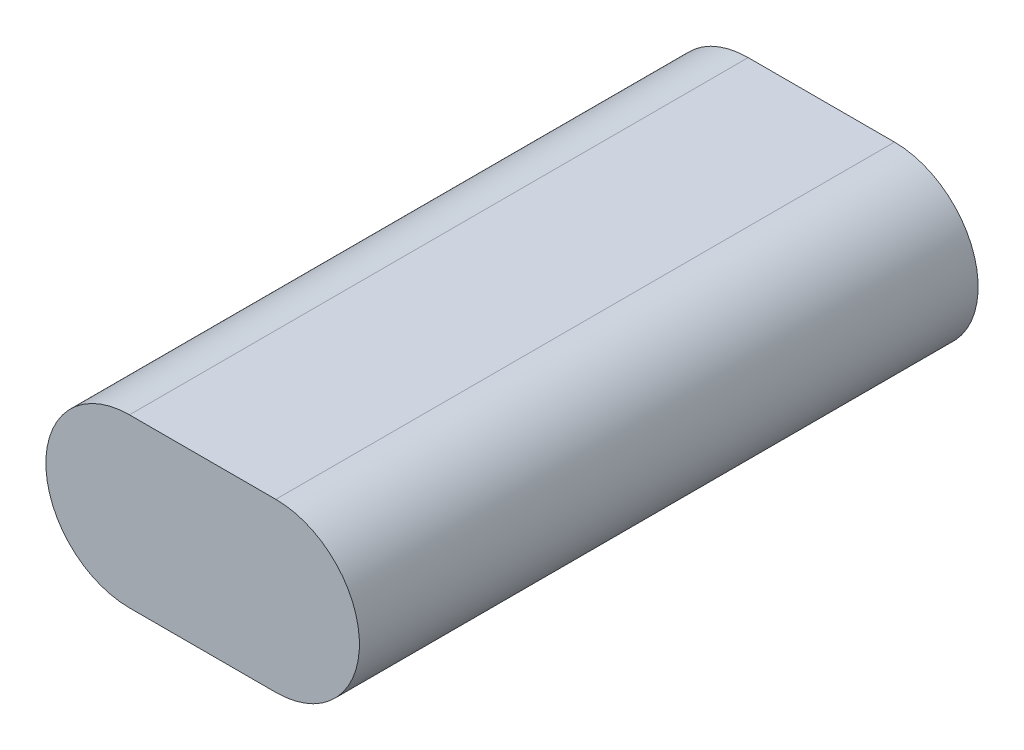
ISO-10303-21;
HEADER;
FILE_DESCRIPTION(('STEP AP214'),'2;1');
FILE_NAME('part.step','',(''),(''),'','','');
FILE_SCHEMA(('AUTOMOTIVE_DESIGN { 1 0 10303 214 1 1 1 1 }'));
ENDSEC;
DATA;
#1=APPLICATION_CONTEXT('core data for automotive mechanical design processes');
#2=APPLICATION_PROTOCOL_DEFINITION('international standard','automotive_design',2000,#1);
#3=PRODUCT_CONTEXT('',#1,'mechanical');
#4=PRODUCT('Part','Part','',(#3));
#5=PRODUCT_RELATED_PRODUCT_CATEGORY('part','',(#4));
#6=PRODUCT_DEFINITION_FORMATION('','',#4);
#7=PRODUCT_DEFINITION_CONTEXT('part definition',#1,'design');
#8=PRODUCT_DEFINITION('design','',#6,#7);
#9=PRODUCT_DEFINITION_SHAPE('','',#8);
#10=(LENGTH_UNIT() NAMED_UNIT(*) SI_UNIT(.MILLI.,.METRE.));
#11=(NAMED_UNIT(*) PLANE_ANGLE_UNIT() SI_UNIT($,.RADIAN.));
#12=(NAMED_UNIT(*) SI_UNIT($,.STERADIAN.) SOLID_ANGLE_UNIT());
#13=UNCERTAINTY_MEASURE_WITH_UNIT(LENGTH_MEASURE(1.E-05),#10,'distance_accuracy_value','');
#14=(GEOMETRIC_REPRESENTATION_CONTEXT(3) GLOBAL_UNCERTAINTY_ASSIGNED_CONTEXT((#13)) GLOBAL_UNIT_ASSIGNED_CONTEXT((#10,
#11,#12)) REPRESENTATION_CONTEXT('',''));
#15=CARTESIAN_POINT('',(0.,0.,0.));
#16=DIRECTION('',(0.,0.,1.));
#17=DIRECTION('',(1.,0.,0.));
#18=AXIS2_PLACEMENT_3D('',#15,#16,#17);
#19=CARTESIAN_POINT('',(8.75,10.,37.));
#20=DIRECTION('',(0.,0.,-1.));
#21=DIRECTION('',(-1.,0.,0.));
#22=AXIS2_PLACEMENT_3D('',#19,#20,#21);
#23=CYLINDRICAL_SURFACE('',#22,10.);
#24=DIRECTION('',(0.,0.,1.));
#25=VECTOR('',#24,1.);
#26=CARTESIAN_POINT('',(8.75,20.,37.));
#27=LINE('',#26,#25);
#28=CARTESIAN_POINT('',(8.75,20.,37.));
#29=VERTEX_POINT('',#28);
#30=CARTESIAN_POINT('',(8.75,20.,-37.));
#31=VERTEX_POINT('',#30);
#32=EDGE_CURVE('E98',#29,#31,#27,.F.);
#33=ORIENTED_EDGE('',*,*,#32,.F.);
#34=CARTESIAN_POINT('',(8.75,10.,37.));
#35=DIRECTION('',(0.,0.,-1.));
#36=DIRECTION('',(-1.,0.,0.));
#37=AXIS2_PLACEMENT_3D('',#34,#35,#36);
#38=CIRCLE('',#37,10.);
#39=CARTESIAN_POINT('',(8.75,0.,37.));
#40=VERTEX_POINT('',#39);
#41=EDGE_CURVE('E56',#40,#29,#38,.F.);
#42=ORIENTED_EDGE('',*,*,#41,.F.);
#43=DIRECTION('',(0.,0.,-1.));
#44=VECTOR('',#43,1.);
#45=CARTESIAN_POINT('',(8.75,0.,0.));
#46=LINE('',#45,#44);
#47=CARTESIAN_POINT('',(8.75,0.,-37.));
#48=VERTEX_POINT('',#47);
#49=EDGE_CURVE('E128',#48,#40,#46,.F.);
#50=ORIENTED_EDGE('',*,*,#49,.F.);
#51=CARTESIAN_POINT('',(8.75,10.,-37.));
#52=DIRECTION('',(0.,0.,1.));
#53=DIRECTION('',(1.,0.,0.));
#54=AXIS2_PLACEMENT_3D('',#51,#52,#53);
#55=CIRCLE('',#54,10.);
#56=EDGE_CURVE('E11',#31,#48,#55,.F.);
#57=ORIENTED_EDGE('',*,*,#56,.F.);
#58=EDGE_LOOP('',(#33,#42,#50,#57));
#59=FACE_BOUND('',#58,.T.);
#60=ADVANCED_FACE('F47',(#59),#23,.T.);
#61=CARTESIAN_POINT('',(-8.74999999999999,10.,-37.));
#62=DIRECTION('',(0.,0.,1.));
#63=DIRECTION('',(1.,0.,0.));
#64=AXIS2_PLACEMENT_3D('',#61,#62,#63);
#65=CYLINDRICAL_SURFACE('',#64,10.);
#66=DIRECTION('',(0.,0.,-1.));
#67=VECTOR('',#66,1.);
#68=CARTESIAN_POINT('',(-8.74999999999999,20.,-37.));
#69=LINE('',#68,#67);
#70=CARTESIAN_POINT('',(-8.74999999999999,20.,-37.));
#71=VERTEX_POINT('',#70);
#72=CARTESIAN_POINT('',(-8.75,20.,37.));
#73=VERTEX_POINT('',#72);
#74=EDGE_CURVE('E90',#71,#73,#69,.F.);
#75=ORIENTED_EDGE('',*,*,#74,.F.);
#76=CARTESIAN_POINT('',(-8.74999999999999,10.,-37.));
#77=DIRECTION('',(0.,0.,1.));
#78=DIRECTION('',(1.,0.,0.));
#79=AXIS2_PLACEMENT_3D('',#76,#77,#78);
#80=CIRCLE('',#79,10.);
#81=CARTESIAN_POINT('',(-8.74999999999999,0.,-37.));
#82=VERTEX_POINT('',#81);
#83=EDGE_CURVE('E99',#82,#71,#80,.F.);
#84=ORIENTED_EDGE('',*,*,#83,.F.);
#85=DIRECTION('',(0.,0.,1.));
#86=VECTOR('',#85,1.);
#87=CARTESIAN_POINT('',(-8.74999999999999,0.,0.));
#88=LINE('',#87,#86);
#89=CARTESIAN_POINT('',(-8.75,0.,37.));
#90=VERTEX_POINT('',#89);
#91=EDGE_CURVE('E92',#90,#82,#88,.F.);
#92=ORIENTED_EDGE('',*,*,#91,.F.);
#93=CARTESIAN_POINT('',(-8.74999999999999,10.,37.));
#94=DIRECTION('',(0.,0.,-1.));
#95=DIRECTION('',(-1.,0.,0.));
#96=AXIS2_PLACEMENT_3D('',#93,#94,#95);
#97=CIRCLE('',#96,10.);
#98=EDGE_CURVE('E86',#73,#90,#97,.F.);
#99=ORIENTED_EDGE('',*,*,#98,.F.);
#100=EDGE_LOOP('',(#75,#84,#92,#99));
#101=FACE_BOUND('',#100,.T.);
#102=ADVANCED_FACE('F88',(#101),#65,.T.);
#103=CARTESIAN_POINT('',(-18.75,20.,37.));
#104=DIRECTION('',(0.,0.,-1.));
#105=DIRECTION('',(-1.,0.,0.));
#106=AXIS2_PLACEMENT_3D('',#103,#104,#105);
#107=PLANE('',#106);
#108=DIRECTION('',(1.,0.,0.));
#109=VECTOR('',#108,1.);
#110=CARTESIAN_POINT('',(-18.75,0.,37.));
#111=LINE('',#110,#109);
#112=EDGE_CURVE('E117',#90,#40,#111,.T.);
#113=ORIENTED_EDGE('',*,*,#112,.T.);
#114=ORIENTED_EDGE('',*,*,#41,.T.);
#115=DIRECTION('',(1.,0.,0.));
#116=VECTOR('',#115,1.);
#117=CARTESIAN_POINT('',(-18.75,20.,37.));
#118=LINE('',#117,#116);
#119=EDGE_CURVE('E105',#73,#29,#118,.T.);
#120=ORIENTED_EDGE('',*,*,#119,.F.);
#121=ORIENTED_EDGE('',*,*,#98,.T.);
#122=EDGE_LOOP('',(#113,#114,#120,#121));
#123=FACE_BOUND('',#122,.T.);
#124=ADVANCED_FACE('F110',(#123),#107,.F.);
#125=CARTESIAN_POINT('',(-18.75,20.,-37.));
#126=DIRECTION('',(0.,0.,1.));
#127=DIRECTION('',(1.,0.,0.));
#128=AXIS2_PLACEMENT_3D('',#125,#126,#127);
#129=PLANE('',#128);
#130=DIRECTION('',(-1.,0.,0.));
#131=VECTOR('',#130,1.);
#132=CARTESIAN_POINT('',(-18.75,20.,-37.));
#133=LINE('',#132,#131);
#134=EDGE_CURVE('E106',#31,#71,#133,.T.);
#135=ORIENTED_EDGE('',*,*,#134,.F.);
#136=ORIENTED_EDGE('',*,*,#56,.T.);
#137=DIRECTION('',(-1.,0.,0.));
#138=VECTOR('',#137,1.);
#139=CARTESIAN_POINT('',(-18.75,0.,-37.));
#140=LINE('',#139,#138);
#141=EDGE_CURVE('E112',#48,#82,#140,.T.);
#142=ORIENTED_EDGE('',*,*,#141,.T.);
#143=ORIENTED_EDGE('',*,*,#83,.T.);
#144=EDGE_LOOP('',(#135,#136,#142,#143));
#145=FACE_BOUND('',#144,.T.);
#146=ADVANCED_FACE('F134',(#145),#129,.F.);
#147=CARTESIAN_POINT('',(0.,20.,0.));
#148=DIRECTION('',(0.,1.,0.));
#149=DIRECTION('',(0.,0.,1.));
#150=AXIS2_PLACEMENT_3D('',#147,#148,#149);
#151=PLANE('',#150);
#152=ORIENTED_EDGE('',*,*,#119,.T.);
#153=ORIENTED_EDGE('',*,*,#32,.T.);
#154=ORIENTED_EDGE('',*,*,#134,.T.);
#155=ORIENTED_EDGE('',*,*,#74,.T.);
#156=EDGE_LOOP('',(#152,#153,#154,#155));
#157=FACE_BOUND('',#156,.T.);
#158=ADVANCED_FACE('F103',(#157),#151,.T.);
#159=CARTESIAN_POINT('',(0.,0.,0.));
#160=DIRECTION('',(0.,1.,0.));
#161=DIRECTION('',(0.,0.,1.));
#162=AXIS2_PLACEMENT_3D('',#159,#160,#161);
#163=PLANE('',#162);
#164=ORIENTED_EDGE('',*,*,#141,.F.);
#165=ORIENTED_EDGE('',*,*,#49,.T.);
#166=ORIENTED_EDGE('',*,*,#112,.F.);
#167=ORIENTED_EDGE('',*,*,#91,.T.);
#168=EDGE_LOOP('',(#164,#165,#166,#167));
#169=FACE_BOUND('',#168,.T.);
#170=ADVANCED_FACE('F133',(#169),#163,.F.);
#171=CLOSED_SHELL('',(#60,#102,#124,#146,#158,#170));
#172=MANIFOLD_SOLID_BREP('B2',#171);
#173=ADVANCED_BREP_SHAPE_REPRESENTATION('',(#18,#172),#14);
#174=SHAPE_DEFINITION_REPRESENTATION(#9,#173);
ENDSEC;
END-ISO-10303-21;
